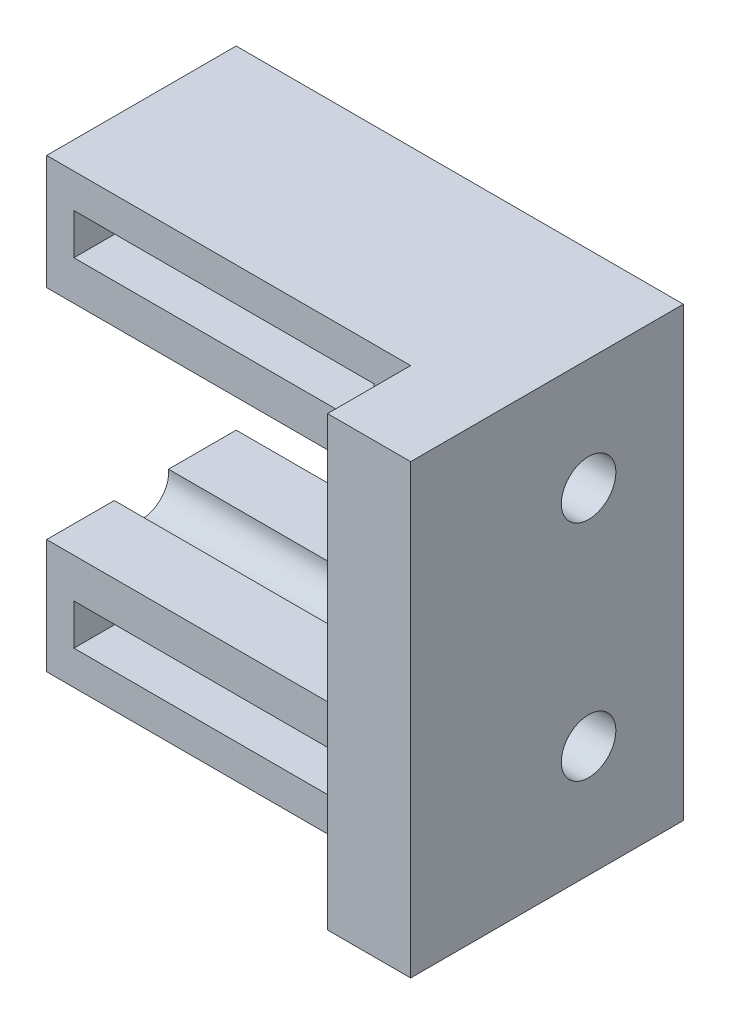
ISO-10303-21;
HEADER;
FILE_DESCRIPTION(('STEP AP214'),'2;1');
FILE_NAME('part.step','',(''),(''),'','','');
FILE_SCHEMA(('AUTOMOTIVE_DESIGN { 1 0 10303 214 1 1 1 1 }'));
ENDSEC;
DATA;
#1=APPLICATION_CONTEXT('core data for automotive mechanical design processes');
#2=APPLICATION_PROTOCOL_DEFINITION('international standard','automotive_design',2000,#1);
#3=PRODUCT_CONTEXT('',#1,'mechanical');
#4=PRODUCT('Part','Part','',(#3));
#5=PRODUCT_RELATED_PRODUCT_CATEGORY('part','',(#4));
#6=PRODUCT_DEFINITION_FORMATION('','',#4);
#7=PRODUCT_DEFINITION_CONTEXT('part definition',#1,'design');
#8=PRODUCT_DEFINITION('design','',#6,#7);
#9=PRODUCT_DEFINITION_SHAPE('','',#8);
#10=(LENGTH_UNIT() NAMED_UNIT(*) SI_UNIT(.MILLI.,.METRE.));
#11=(NAMED_UNIT(*) PLANE_ANGLE_UNIT() SI_UNIT($,.RADIAN.));
#12=(NAMED_UNIT(*) SI_UNIT($,.STERADIAN.) SOLID_ANGLE_UNIT());
#13=UNCERTAINTY_MEASURE_WITH_UNIT(LENGTH_MEASURE(1.E-05),#10,'distance_accuracy_value','');
#14=(GEOMETRIC_REPRESENTATION_CONTEXT(3) GLOBAL_UNCERTAINTY_ASSIGNED_CONTEXT((#13)) GLOBAL_UNIT_ASSIGNED_CONTEXT((#10,
#11,#12)) REPRESENTATION_CONTEXT('',''));
#15=CARTESIAN_POINT('',(0.,0.,0.));
#16=DIRECTION('',(0.,0.,1.));
#17=DIRECTION('',(1.,0.,0.));
#18=AXIS2_PLACEMENT_3D('',#15,#16,#17);
#19=CARTESIAN_POINT('',(0.,-8.,13.9));
#20=DIRECTION('',(0.,1.,0.));
#21=DIRECTION('',(0.,0.,1.));
#22=AXIS2_PLACEMENT_3D('',#19,#20,#21);
#23=PLANE('',#22);
#24=DIRECTION('',(1.,0.,0.));
#25=VECTOR('',#24,1.);
#26=CARTESIAN_POINT('',(-16.4,-8.,8.93997487421324));
#27=LINE('',#26,#25);
#28=CARTESIAN_POINT('',(-16.4,-8.,8.93997487421324));
#29=VERTEX_POINT('',#28);
#30=CARTESIAN_POINT('',(7.6,-8.,8.93997487421324));
#31=VERTEX_POINT('',#30);
#32=EDGE_CURVE('E191',#29,#31,#27,.T.);
#33=ORIENTED_EDGE('',*,*,#32,.F.);
#34=DIRECTION('',(0.,0.,-1.));
#35=VECTOR('',#34,1.);
#36=CARTESIAN_POINT('',(-16.4,-8.,13.9));
#37=LINE('',#36,#35);
#38=CARTESIAN_POINT('',(-16.4,-8.,13.9));
#39=VERTEX_POINT('',#38);
#40=EDGE_CURVE('E202',#39,#29,#37,.T.);
#41=ORIENTED_EDGE('',*,*,#40,.F.);
#42=DIRECTION('',(1.,0.,0.));
#43=VECTOR('',#42,1.);
#44=CARTESIAN_POINT('',(0.,-8.,13.9));
#45=LINE('',#44,#43);
#46=CARTESIAN_POINT('',(7.6,-8.,13.9));
#47=VERTEX_POINT('',#46);
#48=EDGE_CURVE('E317',#39,#47,#45,.T.);
#49=ORIENTED_EDGE('',*,*,#48,.T.);
#50=DIRECTION('',(0.,0.,-1.));
#51=VECTOR('',#50,1.);
#52=CARTESIAN_POINT('',(7.6,-8.,13.9));
#53=LINE('',#52,#51);
#54=EDGE_CURVE('E43',#47,#31,#53,.T.);
#55=ORIENTED_EDGE('',*,*,#54,.T.);
#56=EDGE_LOOP('',(#33,#41,#49,#55));
#57=FACE_BOUND('',#56,.T.);
#58=ADVANCED_FACE('F39',(#57),#23,.T.);
#59=CARTESIAN_POINT('',(0.,8.,13.9));
#60=DIRECTION('',(0.,1.,0.));
#61=DIRECTION('',(0.,0.,1.));
#62=AXIS2_PLACEMENT_3D('',#59,#60,#61);
#63=PLANE('',#62);
#64=DIRECTION('',(0.,0.,-1.));
#65=VECTOR('',#64,1.);
#66=CARTESIAN_POINT('',(-16.4,8.,13.9));
#67=LINE('',#66,#65);
#68=CARTESIAN_POINT('',(-16.4,8.,13.9));
#69=VERTEX_POINT('',#68);
#70=CARTESIAN_POINT('',(-16.4,8.,8.93997487421324));
#71=VERTEX_POINT('',#70);
#72=EDGE_CURVE('E218',#69,#71,#67,.T.);
#73=ORIENTED_EDGE('',*,*,#72,.T.);
#74=DIRECTION('',(1.,0.,0.));
#75=VECTOR('',#74,1.);
#76=CARTESIAN_POINT('',(-16.4,8.,8.93997487421324));
#77=LINE('',#76,#75);
#78=CARTESIAN_POINT('',(7.6,8.,8.93997487421324));
#79=VERTEX_POINT('',#78);
#80=EDGE_CURVE('E337',#71,#79,#77,.T.);
#81=ORIENTED_EDGE('',*,*,#80,.T.);
#82=DIRECTION('',(0.,0.,-1.));
#83=VECTOR('',#82,1.);
#84=CARTESIAN_POINT('',(7.6,8.,13.9));
#85=LINE('',#84,#83);
#86=CARTESIAN_POINT('',(7.6,8.,13.9));
#87=VERTEX_POINT('',#86);
#88=EDGE_CURVE('E222',#87,#79,#85,.T.);
#89=ORIENTED_EDGE('',*,*,#88,.F.);
#90=DIRECTION('',(1.,0.,0.));
#91=VECTOR('',#90,1.);
#92=CARTESIAN_POINT('',(0.,8.,13.9));
#93=LINE('',#92,#91);
#94=EDGE_CURVE('E305',#69,#87,#93,.T.);
#95=ORIENTED_EDGE('',*,*,#94,.F.);
#96=EDGE_LOOP('',(#73,#81,#89,#95));
#97=FACE_BOUND('',#96,.T.);
#98=ADVANCED_FACE('F363',(#97),#63,.F.);
#99=CARTESIAN_POINT('',(0.,13.9,13.9));
#100=DIRECTION('',(0.,1.,0.));
#101=DIRECTION('',(0.,0.,1.));
#102=AXIS2_PLACEMENT_3D('',#99,#100,#101);
#103=PLANE('',#102);
#104=DIRECTION('',(1.,0.,0.));
#105=VECTOR('',#104,1.);
#106=CARTESIAN_POINT('',(0.,13.9,0.));
#107=LINE('',#106,#105);
#108=CARTESIAN_POINT('',(-14.4,13.9,0.));
#109=VERTEX_POINT('',#108);
#110=CARTESIAN_POINT('',(7.6,13.9,0.));
#111=VERTEX_POINT('',#110);
#112=EDGE_CURVE('E250',#109,#111,#107,.T.);
#113=ORIENTED_EDGE('',*,*,#112,.T.);
#114=DIRECTION('',(0.,0.,-1.));
#115=VECTOR('',#114,1.);
#116=CARTESIAN_POINT('',(7.6,13.9,13.9));
#117=LINE('',#116,#115);
#118=CARTESIAN_POINT('',(7.6,13.9,13.9));
#119=VERTEX_POINT('',#118);
#120=EDGE_CURVE('E11',#119,#111,#117,.T.);
#121=ORIENTED_EDGE('',*,*,#120,.F.);
#122=DIRECTION('',(1.,0.,0.));
#123=VECTOR('',#122,1.);
#124=CARTESIAN_POINT('',(0.,13.9,13.9));
#125=LINE('',#124,#123);
#126=CARTESIAN_POINT('',(-14.4,13.9,13.9));
#127=VERTEX_POINT('',#126);
#128=EDGE_CURVE('E291',#127,#119,#125,.T.);
#129=ORIENTED_EDGE('',*,*,#128,.F.);
#130=DIRECTION('',(0.,0.,-1.));
#131=VECTOR('',#130,1.);
#132=CARTESIAN_POINT('',(-14.4,13.9,13.9));
#133=LINE('',#132,#131);
#134=EDGE_CURVE('E229',#127,#109,#133,.T.);
#135=ORIENTED_EDGE('',*,*,#134,.T.);
#136=EDGE_LOOP('',(#113,#121,#129,#135));
#137=FACE_BOUND('',#136,.T.);
#138=ADVANCED_FACE('F421',(#137),#103,.F.);
#139=CARTESIAN_POINT('',(7.6,0.,13.9));
#140=DIRECTION('',(1.,0.,0.));
#141=DIRECTION('',(0.,1.,0.));
#142=AXIS2_PLACEMENT_3D('',#139,#140,#141);
#143=PLANE('',#142);
#144=DIRECTION('',(0.,-1.,0.));
#145=VECTOR('',#144,1.);
#146=CARTESIAN_POINT('',(7.6,0.,0.));
#147=LINE('',#146,#145);
#148=CARTESIAN_POINT('',(7.6,10.9,0.));
#149=VERTEX_POINT('',#148);
#150=EDGE_CURVE('E247',#111,#149,#147,.T.);
#151=ORIENTED_EDGE('',*,*,#150,.T.);
#152=DIRECTION('',(0.,0.,-1.));
#153=VECTOR('',#152,1.);
#154=CARTESIAN_POINT('',(7.6,10.9,13.9));
#155=LINE('',#154,#153);
#156=CARTESIAN_POINT('',(7.6,10.9,13.9));
#157=VERTEX_POINT('',#156);
#158=EDGE_CURVE('E48',#157,#149,#155,.T.);
#159=ORIENTED_EDGE('',*,*,#158,.F.);
#160=DIRECTION('',(0.,-1.,0.));
#161=VECTOR('',#160,1.);
#162=CARTESIAN_POINT('',(7.6,0.,13.9));
#163=LINE('',#162,#161);
#164=EDGE_CURVE('E289',#119,#157,#163,.T.);
#165=ORIENTED_EDGE('',*,*,#164,.F.);
#166=ORIENTED_EDGE('',*,*,#120,.T.);
#167=EDGE_LOOP('',(#151,#159,#165,#166));
#168=FACE_BOUND('',#167,.T.);
#169=ADVANCED_FACE('F426',(#168),#143,.F.);
#170=CARTESIAN_POINT('',(0.,10.9,13.9));
#171=DIRECTION('',(0.,1.,0.));
#172=DIRECTION('',(-1.,0.,0.));
#173=AXIS2_PLACEMENT_3D('',#170,#171,#172);
#174=PLANE('',#173);
#175=DIRECTION('',(1.,0.,0.));
#176=VECTOR('',#175,1.);
#177=CARTESIAN_POINT('',(0.,10.9,0.));
#178=LINE('',#177,#176);
#179=CARTESIAN_POINT('',(-14.4,10.9,0.));
#180=VERTEX_POINT('',#179);
#181=EDGE_CURVE('E244',#180,#149,#178,.T.);
#182=ORIENTED_EDGE('',*,*,#181,.F.);
#183=DIRECTION('',(0.,0.,-1.));
#184=VECTOR('',#183,1.);
#185=CARTESIAN_POINT('',(-14.4,10.9,13.9));
#186=LINE('',#185,#184);
#187=CARTESIAN_POINT('',(-14.4,10.9,13.9));
#188=VERTEX_POINT('',#187);
#189=EDGE_CURVE('E237',#188,#180,#186,.T.);
#190=ORIENTED_EDGE('',*,*,#189,.F.);
#191=DIRECTION('',(1.,0.,0.));
#192=VECTOR('',#191,1.);
#193=CARTESIAN_POINT('',(0.,10.9,13.9));
#194=LINE('',#193,#192);
#195=EDGE_CURVE('E286',#188,#157,#194,.T.);
#196=ORIENTED_EDGE('',*,*,#195,.T.);
#197=ORIENTED_EDGE('',*,*,#158,.T.);
#198=EDGE_LOOP('',(#182,#190,#196,#197));
#199=FACE_BOUND('',#198,.T.);
#200=ADVANCED_FACE('F455',(#199),#174,.T.);
#201=CARTESIAN_POINT('',(0.,-10.9,13.9));
#202=DIRECTION('',(0.,1.,0.));
#203=DIRECTION('',(0.,0.,1.));
#204=AXIS2_PLACEMENT_3D('',#201,#202,#203);
#205=PLANE('',#204);
#206=DIRECTION('',(1.,0.,0.));
#207=VECTOR('',#206,1.);
#208=CARTESIAN_POINT('',(0.,-10.9,0.));
#209=LINE('',#208,#207);
#210=CARTESIAN_POINT('',(-14.4,-10.9,0.));
#211=VERTEX_POINT('',#210);
#212=CARTESIAN_POINT('',(7.6,-10.9,0.));
#213=VERTEX_POINT('',#212);
#214=EDGE_CURVE('E262',#211,#213,#209,.T.);
#215=ORIENTED_EDGE('',*,*,#214,.T.);
#216=DIRECTION('',(0.,0.,-1.));
#217=VECTOR('',#216,1.);
#218=CARTESIAN_POINT('',(7.6,-10.9,13.9));
#219=LINE('',#218,#217);
#220=CARTESIAN_POINT('',(7.6,-10.9,13.9));
#221=VERTEX_POINT('',#220);
#222=EDGE_CURVE('E226',#221,#213,#219,.T.);
#223=ORIENTED_EDGE('',*,*,#222,.F.);
#224=DIRECTION('',(1.,0.,0.));
#225=VECTOR('',#224,1.);
#226=CARTESIAN_POINT('',(0.,-10.9,13.9));
#227=LINE('',#226,#225);
#228=CARTESIAN_POINT('',(-14.4,-10.9,13.9));
#229=VERTEX_POINT('',#228);
#230=EDGE_CURVE('E302',#229,#221,#227,.T.);
#231=ORIENTED_EDGE('',*,*,#230,.F.);
#232=DIRECTION('',(0.,0.,-1.));
#233=VECTOR('',#232,1.);
#234=CARTESIAN_POINT('',(-14.4,-10.9,13.9));
#235=LINE('',#234,#233);
#236=EDGE_CURVE('E234',#229,#211,#235,.T.);
#237=ORIENTED_EDGE('',*,*,#236,.T.);
#238=EDGE_LOOP('',(#215,#223,#231,#237));
#239=FACE_BOUND('',#238,.T.);
#240=ADVANCED_FACE('F452',(#239),#205,.F.);
#241=CARTESIAN_POINT('',(7.59999999999999,0.,13.9));
#242=DIRECTION('',(1.,0.,0.));
#243=DIRECTION('',(0.,1.,0.));
#244=AXIS2_PLACEMENT_3D('',#241,#242,#243);
#245=PLANE('',#244);
#246=DIRECTION('',(0.,-1.,0.));
#247=VECTOR('',#246,1.);
#248=CARTESIAN_POINT('',(7.59999999999999,0.,0.));
#249=LINE('',#248,#247);
#250=CARTESIAN_POINT('',(7.6,-13.9,0.));
#251=VERTEX_POINT('',#250);
#252=EDGE_CURVE('E259',#213,#251,#249,.T.);
#253=ORIENTED_EDGE('',*,*,#252,.T.);
#254=DIRECTION('',(0.,0.,-1.));
#255=VECTOR('',#254,1.);
#256=CARTESIAN_POINT('',(7.6,-13.9,13.9));
#257=LINE('',#256,#255);
#258=CARTESIAN_POINT('',(7.6,-13.9,13.9));
#259=VERTEX_POINT('',#258);
#260=EDGE_CURVE('E230',#259,#251,#257,.T.);
#261=ORIENTED_EDGE('',*,*,#260,.F.);
#262=DIRECTION('',(0.,-1.,0.));
#263=VECTOR('',#262,1.);
#264=CARTESIAN_POINT('',(7.59999999999999,0.,13.9));
#265=LINE('',#264,#263);
#266=EDGE_CURVE('E300',#221,#259,#265,.T.);
#267=ORIENTED_EDGE('',*,*,#266,.F.);
#268=ORIENTED_EDGE('',*,*,#222,.T.);
#269=EDGE_LOOP('',(#253,#261,#267,#268));
#270=FACE_BOUND('',#269,.T.);
#271=ADVANCED_FACE('F449',(#270),#245,.F.);
#272=CARTESIAN_POINT('',(0.,-13.9,13.9));
#273=DIRECTION('',(0.,1.,0.));
#274=DIRECTION('',(0.,0.,1.));
#275=AXIS2_PLACEMENT_3D('',#272,#273,#274);
#276=PLANE('',#275);
#277=DIRECTION('',(1.,0.,0.));
#278=VECTOR('',#277,1.);
#279=CARTESIAN_POINT('',(0.,-13.9,0.));
#280=LINE('',#279,#278);
#281=CARTESIAN_POINT('',(-14.4,-13.9,0.));
#282=VERTEX_POINT('',#281);
#283=EDGE_CURVE('E256',#282,#251,#280,.T.);
#284=ORIENTED_EDGE('',*,*,#283,.F.);
#285=DIRECTION('',(0.,0.,-1.));
#286=VECTOR('',#285,1.);
#287=CARTESIAN_POINT('',(-14.4,-13.9,13.9));
#288=LINE('',#287,#286);
#289=CARTESIAN_POINT('',(-14.4,-13.9,13.9));
#290=VERTEX_POINT('',#289);
#291=EDGE_CURVE('E232',#290,#282,#288,.T.);
#292=ORIENTED_EDGE('',*,*,#291,.F.);
#293=DIRECTION('',(1.,0.,0.));
#294=VECTOR('',#293,1.);
#295=CARTESIAN_POINT('',(0.,-13.9,13.9));
#296=LINE('',#295,#294);
#297=EDGE_CURVE('E297',#290,#259,#296,.T.);
#298=ORIENTED_EDGE('',*,*,#297,.T.);
#299=ORIENTED_EDGE('',*,*,#260,.T.);
#300=EDGE_LOOP('',(#284,#292,#298,#299));
#301=FACE_BOUND('',#300,.T.);
#302=ADVANCED_FACE('F415',(#301),#276,.T.);
#303=CARTESIAN_POINT('',(7.6,0.,13.9));
#304=DIRECTION('',(-1.,0.,0.));
#305=DIRECTION('',(0.,0.,1.));
#306=AXIS2_PLACEMENT_3D('',#303,#304,#305);
#307=PLANE('',#306);
#308=CARTESIAN_POINT('',(7.6,8.2,6.95));
#309=DIRECTION('',(-1.,0.,0.));
#310=DIRECTION('',(0.,0.,1.));
#311=AXIS2_PLACEMENT_3D('',#308,#309,#310);
#312=CIRCLE('',#311,2.);
#313=CARTESIAN_POINT('',(7.6,8.,4.96002512578676));
#314=VERTEX_POINT('',#313);
#315=EDGE_CURVE('E347',#314,#79,#312,.T.);
#316=ORIENTED_EDGE('',*,*,#315,.F.);
#317=CARTESIAN_POINT('',(7.6,8.,0.));
#318=VERTEX_POINT('',#317);
#319=EDGE_CURVE('E225',#314,#318,#85,.T.);
#320=ORIENTED_EDGE('',*,*,#319,.T.);
#321=DIRECTION('',(0.,1.,0.));
#322=VECTOR('',#321,1.);
#323=CARTESIAN_POINT('',(7.6,0.,0.));
#324=LINE('',#323,#322);
#325=CARTESIAN_POINT('',(7.6,-8.,0.));
#326=VERTEX_POINT('',#325);
#327=EDGE_CURVE('E279',#326,#318,#324,.T.);
#328=ORIENTED_EDGE('',*,*,#327,.F.);
#329=CARTESIAN_POINT('',(7.6,-8.,4.96002512578676));
#330=VERTEX_POINT('',#329);
#331=EDGE_CURVE('E211',#330,#326,#53,.T.);
#332=ORIENTED_EDGE('',*,*,#331,.F.);
#333=CARTESIAN_POINT('',(7.6,-8.2,6.95));
#334=DIRECTION('',(-1.,0.,0.));
#335=DIRECTION('',(0.,0.,1.));
#336=AXIS2_PLACEMENT_3D('',#333,#334,#335);
#337=CIRCLE('',#336,2.);
#338=EDGE_CURVE('E205',#31,#330,#337,.T.);
#339=ORIENTED_EDGE('',*,*,#338,.F.);
#340=ORIENTED_EDGE('',*,*,#54,.F.);
#341=DIRECTION('',(0.,1.,0.));
#342=VECTOR('',#341,1.);
#343=CARTESIAN_POINT('',(7.6,0.,13.9));
#344=LINE('',#343,#342);
#345=EDGE_CURVE('E243',#47,#87,#344,.T.);
#346=ORIENTED_EDGE('',*,*,#345,.T.);
#347=ORIENTED_EDGE('',*,*,#88,.T.);
#348=EDGE_LOOP('',(#316,#320,#328,#332,#339,#340,#346,#347));
#349=FACE_BOUND('',#348,.T.);
#350=ADVANCED_FACE('F41',(#349),#307,.T.);
#351=DIRECTION('',(1.,0.,0.));
#352=VECTOR('',#351,1.);
#353=CARTESIAN_POINT('',(-16.4,-8.,4.96002512578676));
#354=LINE('',#353,#352);
#355=CARTESIAN_POINT('',(-16.4,-8.,4.96002512578676));
#356=VERTEX_POINT('',#355);
#357=EDGE_CURVE('E56',#330,#356,#354,.F.);
#358=ORIENTED_EDGE('',*,*,#357,.F.);
#359=ORIENTED_EDGE('',*,*,#331,.T.);
#360=DIRECTION('',(1.,0.,0.));
#361=VECTOR('',#360,1.);
#362=CARTESIAN_POINT('',(0.,-8.,0.));
#363=LINE('',#362,#361);
#364=CARTESIAN_POINT('',(-16.4,-8.,0.));
#365=VERTEX_POINT('',#364);
#366=EDGE_CURVE('E276',#365,#326,#363,.T.);
#367=ORIENTED_EDGE('',*,*,#366,.F.);
#368=EDGE_CURVE('E212',#356,#365,#37,.T.);
#369=ORIENTED_EDGE('',*,*,#368,.F.);
#370=EDGE_LOOP('',(#358,#359,#367,#369));
#371=FACE_BOUND('',#370,.T.);
#372=ADVANCED_FACE('F407',(#371),#23,.T.);
#373=CARTESIAN_POINT('',(-16.4,0.,13.9));
#374=DIRECTION('',(-1.,0.,0.));
#375=DIRECTION('',(0.,0.,1.));
#376=AXIS2_PLACEMENT_3D('',#373,#374,#375);
#377=PLANE('',#376);
#378=CARTESIAN_POINT('',(-16.4,-8.2,6.95));
#379=DIRECTION('',(1.,0.,0.));
#380=DIRECTION('',(0.,0.,-1.));
#381=AXIS2_PLACEMENT_3D('',#378,#379,#380);
#382=CIRCLE('',#381,2.);
#383=EDGE_CURVE('E187',#29,#356,#382,.T.);
#384=ORIENTED_EDGE('',*,*,#383,.T.);
#385=ORIENTED_EDGE('',*,*,#368,.T.);
#386=DIRECTION('',(0.,1.,0.));
#387=VECTOR('',#386,1.);
#388=CARTESIAN_POINT('',(-16.4,0.,0.));
#389=LINE('',#388,#387);
#390=CARTESIAN_POINT('',(-16.4,-16.4,0.));
#391=VERTEX_POINT('',#390);
#392=EDGE_CURVE('E273',#391,#365,#389,.T.);
#393=ORIENTED_EDGE('',*,*,#392,.F.);
#394=DIRECTION('',(0.,0.,-1.));
#395=VECTOR('',#394,1.);
#396=CARTESIAN_POINT('',(-16.4,-16.4,13.9));
#397=LINE('',#396,#395);
#398=CARTESIAN_POINT('',(-16.4,-16.4,13.9));
#399=VERTEX_POINT('',#398);
#400=EDGE_CURVE('E213',#399,#391,#397,.T.);
#401=ORIENTED_EDGE('',*,*,#400,.F.);
#402=DIRECTION('',(0.,1.,0.));
#403=VECTOR('',#402,1.);
#404=CARTESIAN_POINT('',(-16.4,0.,13.9));
#405=LINE('',#404,#403);
#406=EDGE_CURVE('E210',#399,#39,#405,.T.);
#407=ORIENTED_EDGE('',*,*,#406,.T.);
#408=ORIENTED_EDGE('',*,*,#40,.T.);
#409=EDGE_LOOP('',(#384,#385,#393,#401,#407,#408));
#410=FACE_BOUND('',#409,.T.);
#411=ADVANCED_FACE('F208',(#410),#377,.T.);
#412=CARTESIAN_POINT('',(0.,-16.4,13.9));
#413=DIRECTION('',(0.,1.,0.));
#414=DIRECTION('',(0.,0.,1.));
#415=AXIS2_PLACEMENT_3D('',#412,#413,#414);
#416=PLANE('',#415);
#417=DIRECTION('',(1.,0.,0.));
#418=VECTOR('',#417,1.);
#419=CARTESIAN_POINT('',(0.,-16.4,0.));
#420=LINE('',#419,#418);
#421=CARTESIAN_POINT('',(16.4,-16.4,0.));
#422=VERTEX_POINT('',#421);
#423=EDGE_CURVE('E271',#391,#422,#420,.T.);
#424=ORIENTED_EDGE('',*,*,#423,.T.);
#425=DIRECTION('',(0.,0.,-1.));
#426=VECTOR('',#425,1.);
#427=CARTESIAN_POINT('',(16.4,-16.4,20.));
#428=LINE('',#427,#426);
#429=CARTESIAN_POINT('',(16.4,-16.4,20.));
#430=VERTEX_POINT('',#429);
#431=EDGE_CURVE('E326',#430,#422,#428,.T.);
#432=ORIENTED_EDGE('',*,*,#431,.F.);
#433=DIRECTION('',(1.,0.,0.));
#434=VECTOR('',#433,1.);
#435=CARTESIAN_POINT('',(0.,-16.4,20.));
#436=LINE('',#435,#434);
#437=CARTESIAN_POINT('',(10.3,-16.4,20.));
#438=VERTEX_POINT('',#437);
#439=EDGE_CURVE('E339',#438,#430,#436,.T.);
#440=ORIENTED_EDGE('',*,*,#439,.F.);
#441=DIRECTION('',(0.,0.,-1.));
#442=VECTOR('',#441,1.);
#443=CARTESIAN_POINT('',(10.3,-16.4,20.));
#444=LINE('',#443,#442);
#445=CARTESIAN_POINT('',(10.3,-16.4,13.9));
#446=VERTEX_POINT('',#445);
#447=EDGE_CURVE('E323',#438,#446,#444,.T.);
#448=ORIENTED_EDGE('',*,*,#447,.T.);
#449=DIRECTION('',(1.,0.,0.));
#450=VECTOR('',#449,1.);
#451=CARTESIAN_POINT('',(0.,-16.4,13.9));
#452=LINE('',#451,#450);
#453=EDGE_CURVE('E314',#399,#446,#452,.T.);
#454=ORIENTED_EDGE('',*,*,#453,.F.);
#455=ORIENTED_EDGE('',*,*,#400,.T.);
#456=EDGE_LOOP('',(#424,#432,#440,#448,#454,#455));
#457=FACE_BOUND('',#456,.T.);
#458=ADVANCED_FACE('F395',(#457),#416,.F.);
#459=CARTESIAN_POINT('',(0.,16.4,13.9));
#460=DIRECTION('',(0.,1.,0.));
#461=DIRECTION('',(0.,0.,1.));
#462=AXIS2_PLACEMENT_3D('',#459,#460,#461);
#463=PLANE('',#462);
#464=DIRECTION('',(1.,0.,0.));
#465=VECTOR('',#464,1.);
#466=CARTESIAN_POINT('',(0.,16.4,0.));
#467=LINE('',#466,#465);
#468=CARTESIAN_POINT('',(-16.4,16.4,0.));
#469=VERTEX_POINT('',#468);
#470=CARTESIAN_POINT('',(16.4,16.4,0.));
#471=VERTEX_POINT('',#470);
#472=EDGE_CURVE('E269',#469,#471,#467,.T.);
#473=ORIENTED_EDGE('',*,*,#472,.F.);
#474=DIRECTION('',(0.,0.,-1.));
#475=VECTOR('',#474,1.);
#476=CARTESIAN_POINT('',(-16.4,16.4,13.9));
#477=LINE('',#476,#475);
#478=CARTESIAN_POINT('',(-16.4,16.4,13.9));
#479=VERTEX_POINT('',#478);
#480=EDGE_CURVE('E216',#479,#469,#477,.T.);
#481=ORIENTED_EDGE('',*,*,#480,.F.);
#482=DIRECTION('',(1.,0.,0.));
#483=VECTOR('',#482,1.);
#484=CARTESIAN_POINT('',(0.,16.4,13.9));
#485=LINE('',#484,#483);
#486=CARTESIAN_POINT('',(10.3,16.4,13.9));
#487=VERTEX_POINT('',#486);
#488=EDGE_CURVE('E308',#479,#487,#485,.T.);
#489=ORIENTED_EDGE('',*,*,#488,.T.);
#490=DIRECTION('',(0.,0.,-1.));
#491=VECTOR('',#490,1.);
#492=CARTESIAN_POINT('',(10.3,16.4,20.));
#493=LINE('',#492,#491);
#494=CARTESIAN_POINT('',(10.3,16.4,20.));
#495=VERTEX_POINT('',#494);
#496=EDGE_CURVE('E282',#495,#487,#493,.T.);
#497=ORIENTED_EDGE('',*,*,#496,.F.);
#498=DIRECTION('',(1.,0.,0.));
#499=VECTOR('',#498,1.);
#500=CARTESIAN_POINT('',(0.,16.4,20.));
#501=LINE('',#500,#499);
#502=CARTESIAN_POINT('',(16.4,16.4,20.));
#503=VERTEX_POINT('',#502);
#504=EDGE_CURVE('E336',#495,#503,#501,.T.);
#505=ORIENTED_EDGE('',*,*,#504,.T.);
#506=DIRECTION('',(0.,0.,-1.));
#507=VECTOR('',#506,1.);
#508=CARTESIAN_POINT('',(16.4,16.4,20.));
#509=LINE('',#508,#507);
#510=EDGE_CURVE('E329',#503,#471,#509,.T.);
#511=ORIENTED_EDGE('',*,*,#510,.T.);
#512=EDGE_LOOP('',(#473,#481,#489,#497,#505,#511));
#513=FACE_BOUND('',#512,.T.);
#514=ADVANCED_FACE('F374',(#513),#463,.T.);
#515=CARTESIAN_POINT('',(-16.4,8.2,6.95));
#516=DIRECTION('',(1.,0.,0.));
#517=DIRECTION('',(0.,0.,-1.));
#518=AXIS2_PLACEMENT_3D('',#515,#516,#517);
#519=CIRCLE('',#518,2.);
#520=CARTESIAN_POINT('',(-16.4,8.,4.96002512578676));
#521=VERTEX_POINT('',#520);
#522=EDGE_CURVE('E64',#521,#71,#519,.T.);
#523=ORIENTED_EDGE('',*,*,#522,.T.);
#524=ORIENTED_EDGE('',*,*,#72,.F.);
#525=EDGE_CURVE('E307',#69,#479,#405,.T.);
#526=ORIENTED_EDGE('',*,*,#525,.T.);
#527=ORIENTED_EDGE('',*,*,#480,.T.);
#528=CARTESIAN_POINT('',(-16.4,8.,0.));
#529=VERTEX_POINT('',#528);
#530=EDGE_CURVE('E268',#529,#469,#389,.T.);
#531=ORIENTED_EDGE('',*,*,#530,.F.);
#532=EDGE_CURVE('E221',#521,#529,#67,.T.);
#533=ORIENTED_EDGE('',*,*,#532,.F.);
#534=EDGE_LOOP('',(#523,#524,#526,#527,#531,#533));
#535=FACE_BOUND('',#534,.T.);
#536=ADVANCED_FACE('F358',(#535),#377,.T.);
#537=CARTESIAN_POINT('',(-14.4,0.,13.9));
#538=DIRECTION('',(1.,0.,0.));
#539=DIRECTION('',(0.,1.,0.));
#540=AXIS2_PLACEMENT_3D('',#537,#538,#539);
#541=PLANE('',#540);
#542=DIRECTION('',(0.,-1.,0.));
#543=VECTOR('',#542,1.);
#544=CARTESIAN_POINT('',(-14.4,0.,0.));
#545=LINE('',#544,#543);
#546=EDGE_CURVE('E253',#211,#282,#545,.T.);
#547=ORIENTED_EDGE('',*,*,#546,.F.);
#548=ORIENTED_EDGE('',*,*,#236,.F.);
#549=DIRECTION('',(0.,-1.,0.));
#550=VECTOR('',#549,1.);
#551=CARTESIAN_POINT('',(-14.4,0.,13.9));
#552=LINE('',#551,#550);
#553=EDGE_CURVE('E294',#229,#290,#552,.T.);
#554=ORIENTED_EDGE('',*,*,#553,.T.);
#555=ORIENTED_EDGE('',*,*,#291,.T.);
#556=EDGE_LOOP('',(#547,#548,#554,#555));
#557=FACE_BOUND('',#556,.T.);
#558=ADVANCED_FACE('F432',(#557),#541,.T.);
#559=ORIENTED_EDGE('',*,*,#319,.F.);
#560=DIRECTION('',(1.,0.,0.));
#561=VECTOR('',#560,1.);
#562=CARTESIAN_POINT('',(-16.4,8.,4.96002512578676));
#563=LINE('',#562,#561);
#564=EDGE_CURVE('E204',#314,#521,#563,.F.);
#565=ORIENTED_EDGE('',*,*,#564,.T.);
#566=ORIENTED_EDGE('',*,*,#532,.T.);
#567=DIRECTION('',(1.,0.,0.));
#568=VECTOR('',#567,1.);
#569=CARTESIAN_POINT('',(0.,8.,0.));
#570=LINE('',#569,#568);
#571=EDGE_CURVE('E265',#529,#318,#570,.T.);
#572=ORIENTED_EDGE('',*,*,#571,.T.);
#573=EDGE_LOOP('',(#559,#565,#566,#572));
#574=FACE_BOUND('',#573,.T.);
#575=ADVANCED_FACE('F384',(#574),#63,.F.);
#576=CARTESIAN_POINT('',(-14.4,0.,13.9));
#577=DIRECTION('',(1.,0.,0.));
#578=DIRECTION('',(0.,0.,-1.));
#579=AXIS2_PLACEMENT_3D('',#576,#577,#578);
#580=PLANE('',#579);
#581=DIRECTION('',(0.,-1.,0.));
#582=VECTOR('',#581,1.);
#583=CARTESIAN_POINT('',(-14.4,0.,0.));
#584=LINE('',#583,#582);
#585=EDGE_CURVE('E240',#109,#180,#584,.T.);
#586=ORIENTED_EDGE('',*,*,#585,.F.);
#587=ORIENTED_EDGE('',*,*,#134,.F.);
#588=DIRECTION('',(0.,-1.,0.));
#589=VECTOR('',#588,1.);
#590=CARTESIAN_POINT('',(-14.4,0.,13.9));
#591=LINE('',#590,#589);
#592=EDGE_CURVE('E283',#127,#188,#591,.T.);
#593=ORIENTED_EDGE('',*,*,#592,.T.);
#594=ORIENTED_EDGE('',*,*,#189,.T.);
#595=EDGE_LOOP('',(#586,#587,#593,#594));
#596=FACE_BOUND('',#595,.T.);
#597=ADVANCED_FACE('F431',(#596),#580,.T.);
#598=CARTESIAN_POINT('',(0.,0.,13.9));
#599=DIRECTION('',(0.,0.,1.));
#600=DIRECTION('',(1.,0.,0.));
#601=AXIS2_PLACEMENT_3D('',#598,#599,#600);
#602=PLANE('',#601);
#603=ORIENTED_EDGE('',*,*,#345,.F.);
#604=ORIENTED_EDGE('',*,*,#48,.F.);
#605=ORIENTED_EDGE('',*,*,#406,.F.);
#606=ORIENTED_EDGE('',*,*,#453,.T.);
#607=DIRECTION('',(0.,-1.,0.));
#608=VECTOR('',#607,1.);
#609=CARTESIAN_POINT('',(10.3,0.,13.9));
#610=LINE('',#609,#608);
#611=EDGE_CURVE('E311',#487,#446,#610,.T.);
#612=ORIENTED_EDGE('',*,*,#611,.F.);
#613=ORIENTED_EDGE('',*,*,#488,.F.);
#614=ORIENTED_EDGE('',*,*,#525,.F.);
#615=ORIENTED_EDGE('',*,*,#94,.T.);
#616=EDGE_LOOP('',(#603,#604,#605,#606,#612,#613,#614,#615));
#617=FACE_BOUND('',#616,.T.);
#618=ORIENTED_EDGE('',*,*,#230,.T.);
#619=ORIENTED_EDGE('',*,*,#266,.T.);
#620=ORIENTED_EDGE('',*,*,#297,.F.);
#621=ORIENTED_EDGE('',*,*,#553,.F.);
#622=EDGE_LOOP('',(#618,#619,#620,#621));
#623=FACE_BOUND('',#622,.T.);
#624=ORIENTED_EDGE('',*,*,#128,.T.);
#625=ORIENTED_EDGE('',*,*,#164,.T.);
#626=ORIENTED_EDGE('',*,*,#195,.F.);
#627=ORIENTED_EDGE('',*,*,#592,.F.);
#628=EDGE_LOOP('',(#624,#625,#626,#627));
#629=FACE_BOUND('',#628,.T.);
#630=ADVANCED_FACE('F369',(#617,#623,#629),#602,.T.);
#631=CARTESIAN_POINT('',(0.,0.,0.));
#632=DIRECTION('',(0.,0.,1.));
#633=DIRECTION('',(1.,0.,0.));
#634=AXIS2_PLACEMENT_3D('',#631,#632,#633);
#635=PLANE('',#634);
#636=ORIENTED_EDGE('',*,*,#327,.T.);
#637=ORIENTED_EDGE('',*,*,#571,.F.);
#638=ORIENTED_EDGE('',*,*,#530,.T.);
#639=ORIENTED_EDGE('',*,*,#472,.T.);
#640=DIRECTION('',(0.,1.,0.));
#641=VECTOR('',#640,1.);
#642=CARTESIAN_POINT('',(16.4,0.,0.));
#643=LINE('',#642,#641);
#644=EDGE_CURVE('E333',#422,#471,#643,.T.);
#645=ORIENTED_EDGE('',*,*,#644,.F.);
#646=ORIENTED_EDGE('',*,*,#423,.F.);
#647=ORIENTED_EDGE('',*,*,#392,.T.);
#648=ORIENTED_EDGE('',*,*,#366,.T.);
#649=EDGE_LOOP('',(#636,#637,#638,#639,#645,#646,#647,#648));
#650=FACE_BOUND('',#649,.T.);
#651=ORIENTED_EDGE('',*,*,#214,.F.);
#652=ORIENTED_EDGE('',*,*,#546,.T.);
#653=ORIENTED_EDGE('',*,*,#283,.T.);
#654=ORIENTED_EDGE('',*,*,#252,.F.);
#655=EDGE_LOOP('',(#651,#652,#653,#654));
#656=FACE_BOUND('',#655,.T.);
#657=ORIENTED_EDGE('',*,*,#112,.F.);
#658=ORIENTED_EDGE('',*,*,#585,.T.);
#659=ORIENTED_EDGE('',*,*,#181,.T.);
#660=ORIENTED_EDGE('',*,*,#150,.F.);
#661=EDGE_LOOP('',(#657,#658,#659,#660));
#662=FACE_BOUND('',#661,.T.);
#663=ADVANCED_FACE('F379',(#650,#656,#662),#635,.F.);
#664=CARTESIAN_POINT('',(10.3,0.,20.));
#665=DIRECTION('',(1.,0.,0.));
#666=DIRECTION('',(0.,1.,0.));
#667=AXIS2_PLACEMENT_3D('',#664,#665,#666);
#668=PLANE('',#667);
#669=ORIENTED_EDGE('',*,*,#496,.T.);
#670=ORIENTED_EDGE('',*,*,#611,.T.);
#671=ORIENTED_EDGE('',*,*,#447,.F.);
#672=DIRECTION('',(0.,-1.,0.));
#673=VECTOR('',#672,1.);
#674=CARTESIAN_POINT('',(10.3,0.,20.));
#675=LINE('',#674,#673);
#676=EDGE_CURVE('E341',#495,#438,#675,.T.);
#677=ORIENTED_EDGE('',*,*,#676,.F.);
#678=EDGE_LOOP('',(#669,#670,#671,#677));
#679=FACE_BOUND('',#678,.T.);
#680=ADVANCED_FACE('F392',(#679),#668,.F.);
#681=CARTESIAN_POINT('',(16.4,0.,20.));
#682=DIRECTION('',(-1.,0.,0.));
#683=DIRECTION('',(0.,0.,1.));
#684=AXIS2_PLACEMENT_3D('',#681,#682,#683);
#685=PLANE('',#684);
#686=CARTESIAN_POINT('',(16.4,8.2,6.95));
#687=DIRECTION('',(1.,0.,0.));
#688=DIRECTION('',(0.,0.,-1.));
#689=AXIS2_PLACEMENT_3D('',#686,#687,#688);
#690=CIRCLE('',#689,2.);
#691=CARTESIAN_POINT('',(16.4,8.2,4.95));
#692=VERTEX_POINT('',#691);
#693=EDGE_CURVE('E196',#692,#692,#690,.T.);
#694=ORIENTED_EDGE('',*,*,#693,.F.);
#695=EDGE_LOOP('',(#694));
#696=FACE_BOUND('',#695,.T.);
#697=CARTESIAN_POINT('',(16.4,-8.2,6.95));
#698=DIRECTION('',(1.,0.,0.));
#699=DIRECTION('',(0.,0.,-1.));
#700=AXIS2_PLACEMENT_3D('',#697,#698,#699);
#701=CIRCLE('',#700,2.);
#702=CARTESIAN_POINT('',(16.4,-8.2,4.95));
#703=VERTEX_POINT('',#702);
#704=EDGE_CURVE('E197',#703,#703,#701,.T.);
#705=ORIENTED_EDGE('',*,*,#704,.F.);
#706=EDGE_LOOP('',(#705));
#707=FACE_BOUND('',#706,.T.);
#708=ORIENTED_EDGE('',*,*,#644,.T.);
#709=ORIENTED_EDGE('',*,*,#510,.F.);
#710=DIRECTION('',(0.,1.,0.));
#711=VECTOR('',#710,1.);
#712=CARTESIAN_POINT('',(16.4,0.,20.));
#713=LINE('',#712,#711);
#714=EDGE_CURVE('E332',#430,#503,#713,.T.);
#715=ORIENTED_EDGE('',*,*,#714,.F.);
#716=ORIENTED_EDGE('',*,*,#431,.T.);
#717=EDGE_LOOP('',(#708,#709,#715,#716));
#718=FACE_BOUND('',#717,.T.);
#719=ADVANCED_FACE('F402',(#696,#707,#718),#685,.F.);
#720=CARTESIAN_POINT('',(0.,0.,20.));
#721=DIRECTION('',(0.,0.,1.));
#722=DIRECTION('',(1.,0.,0.));
#723=AXIS2_PLACEMENT_3D('',#720,#721,#722);
#724=PLANE('',#723);
#725=ORIENTED_EDGE('',*,*,#504,.F.);
#726=ORIENTED_EDGE('',*,*,#676,.T.);
#727=ORIENTED_EDGE('',*,*,#439,.T.);
#728=ORIENTED_EDGE('',*,*,#714,.T.);
#729=EDGE_LOOP('',(#725,#726,#727,#728));
#730=FACE_BOUND('',#729,.T.);
#731=ADVANCED_FACE('F400',(#730),#724,.T.);
#732=CARTESIAN_POINT('',(-16.4,-8.2,6.95));
#733=DIRECTION('',(1.,0.,0.));
#734=DIRECTION('',(0.,0.,-1.));
#735=AXIS2_PLACEMENT_3D('',#732,#733,#734);
#736=CYLINDRICAL_SURFACE('',#735,2.);
#737=ORIENTED_EDGE('',*,*,#32,.T.);
#738=ORIENTED_EDGE('',*,*,#338,.T.);
#739=ORIENTED_EDGE('',*,*,#357,.T.);
#740=ORIENTED_EDGE('',*,*,#383,.F.);
#741=EDGE_LOOP('',(#737,#738,#739,#740));
#742=FACE_BOUND('',#741,.T.);
#743=ORIENTED_EDGE('',*,*,#704,.T.);
#744=EDGE_LOOP('',(#743));
#745=FACE_BOUND('',#744,.T.);
#746=ADVANCED_FACE('F189',(#742,#745),#736,.F.);
#747=CARTESIAN_POINT('',(-16.4,8.2,6.95));
#748=DIRECTION('',(1.,0.,0.));
#749=DIRECTION('',(0.,0.,-1.));
#750=AXIS2_PLACEMENT_3D('',#747,#748,#749);
#751=CYLINDRICAL_SURFACE('',#750,2.);
#752=ORIENTED_EDGE('',*,*,#693,.T.);
#753=EDGE_LOOP('',(#752));
#754=FACE_BOUND('',#753,.T.);
#755=ORIENTED_EDGE('',*,*,#522,.F.);
#756=ORIENTED_EDGE('',*,*,#564,.F.);
#757=ORIENTED_EDGE('',*,*,#315,.T.);
#758=ORIENTED_EDGE('',*,*,#80,.F.);
#759=EDGE_LOOP('',(#755,#756,#757,#758));
#760=FACE_BOUND('',#759,.T.);
#761=ADVANCED_FACE('F386',(#754,#760),#751,.F.);
#762=CLOSED_SHELL('',(#58,#98,#138,#169,#200,#240,#271,#302,#350,#372,#411,#458,#514,#536,#558,
#575,#597,#630,#663,#680,#719,#731,#746,#761));
#763=MANIFOLD_SOLID_BREP('B2',#762);
#764=ADVANCED_BREP_SHAPE_REPRESENTATION('',(#18,#763),#14);
#765=SHAPE_DEFINITION_REPRESENTATION(#9,#764);
ENDSEC;
END-ISO-10303-21;
